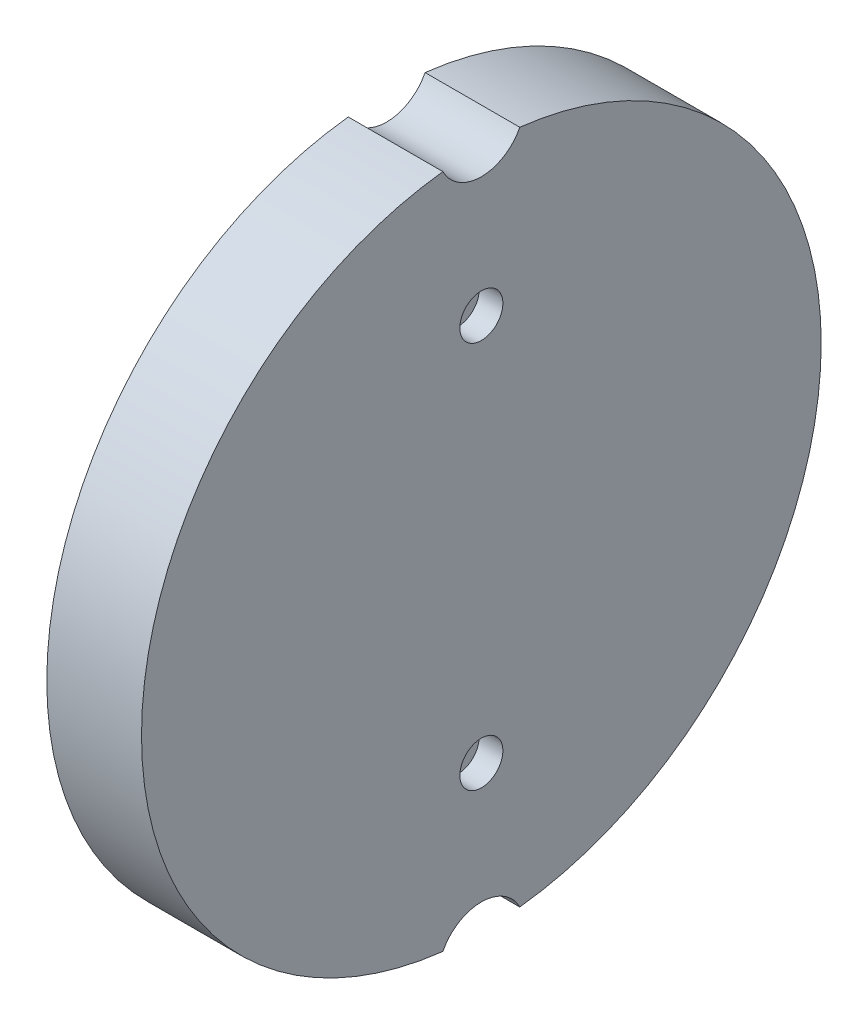
ISO-10303-21;
HEADER;
FILE_DESCRIPTION(('STEP AP214'),'2;1');
FILE_NAME('part.step','',(''),(''),'','','');
FILE_SCHEMA(('AUTOMOTIVE_DESIGN { 1 0 10303 214 1 1 1 1 }'));
ENDSEC;
DATA;
#1=APPLICATION_CONTEXT('core data for automotive mechanical design processes');
#2=APPLICATION_PROTOCOL_DEFINITION('international standard','automotive_design',2000,#1);
#3=PRODUCT_CONTEXT('',#1,'mechanical');
#4=PRODUCT('Part','Part','',(#3));
#5=PRODUCT_RELATED_PRODUCT_CATEGORY('part','',(#4));
#6=PRODUCT_DEFINITION_FORMATION('','',#4);
#7=PRODUCT_DEFINITION_CONTEXT('part definition',#1,'design');
#8=PRODUCT_DEFINITION('design','',#6,#7);
#9=PRODUCT_DEFINITION_SHAPE('','',#8);
#10=(LENGTH_UNIT() NAMED_UNIT(*) SI_UNIT(.MILLI.,.METRE.));
#11=(NAMED_UNIT(*) PLANE_ANGLE_UNIT() SI_UNIT($,.RADIAN.));
#12=(NAMED_UNIT(*) SI_UNIT($,.STERADIAN.) SOLID_ANGLE_UNIT());
#13=UNCERTAINTY_MEASURE_WITH_UNIT(LENGTH_MEASURE(1.E-05),#10,'distance_accuracy_value','');
#14=(GEOMETRIC_REPRESENTATION_CONTEXT(3) GLOBAL_UNCERTAINTY_ASSIGNED_CONTEXT((#13)) GLOBAL_UNIT_ASSIGNED_CONTEXT((#10,
#11,#12)) REPRESENTATION_CONTEXT('',''));
#15=CARTESIAN_POINT('',(0.,0.,0.));
#16=DIRECTION('',(0.,0.,1.));
#17=DIRECTION('',(1.,0.,0.));
#18=AXIS2_PLACEMENT_3D('',#15,#16,#17);
#19=CARTESIAN_POINT('',(55.63,-4.5,0.));
#20=DIRECTION('',(-1.,0.,0.));
#21=DIRECTION('',(0.,0.,1.));
#22=AXIS2_PLACEMENT_3D('',#19,#20,#21);
#23=PLANE('',#22);
#24=CARTESIAN_POINT('',(55.63,-4.5,0.));
#25=DIRECTION('',(1.,0.,0.));
#26=DIRECTION('',(0.,0.,-1.));
#27=AXIS2_PLACEMENT_3D('',#24,#25,#26);
#28=CIRCLE('',#27,0.5);
#29=CARTESIAN_POINT('',(55.63,-4.5,-0.5));
#30=VERTEX_POINT('',#29);
#31=EDGE_CURVE('E19',#30,#30,#28,.T.);
#32=ORIENTED_EDGE('',*,*,#31,.T.);
#33=EDGE_LOOP('',(#32));
#34=FACE_BOUND('',#33,.T.);
#35=ADVANCED_FACE('F16',(#34),#23,.F.);
#36=CARTESIAN_POINT('',(55.63,4.5,0.));
#37=DIRECTION('',(-1.,0.,0.));
#38=DIRECTION('',(0.,0.,1.));
#39=AXIS2_PLACEMENT_3D('',#36,#37,#38);
#40=PLANE('',#39);
#41=CARTESIAN_POINT('',(55.63,4.5,0.));
#42=DIRECTION('',(1.,0.,0.));
#43=DIRECTION('',(0.,0.,-1.));
#44=AXIS2_PLACEMENT_3D('',#41,#42,#43);
#45=CIRCLE('',#44,0.5);
#46=CARTESIAN_POINT('',(55.63,4.5,-0.5));
#47=VERTEX_POINT('',#46);
#48=EDGE_CURVE('E96',#47,#47,#45,.T.);
#49=ORIENTED_EDGE('',*,*,#48,.T.);
#50=EDGE_LOOP('',(#49));
#51=FACE_BOUND('',#50,.T.);
#52=ADVANCED_FACE('F107',(#51),#40,.F.);
#53=CARTESIAN_POINT('',(55.905,-4.5,0.));
#54=DIRECTION('',(1.,0.,0.));
#55=DIRECTION('',(0.,0.,-1.));
#56=AXIS2_PLACEMENT_3D('',#53,#54,#55);
#57=CYLINDRICAL_SURFACE('',#56,0.5);
#58=CARTESIAN_POINT('',(56.18,-4.5,0.));
#59=DIRECTION('',(1.,0.,0.));
#60=DIRECTION('',(0.,0.,-1.));
#61=AXIS2_PLACEMENT_3D('',#58,#59,#60);
#62=CIRCLE('',#61,0.5);
#63=CARTESIAN_POINT('',(56.18,-4.5,-0.5));
#64=VERTEX_POINT('',#63);
#65=EDGE_CURVE('E94',#64,#64,#62,.F.);
#66=ORIENTED_EDGE('',*,*,#65,.F.);
#67=EDGE_LOOP('',(#66));
#68=FACE_BOUND('',#67,.T.);
#69=ORIENTED_EDGE('',*,*,#31,.F.);
#70=EDGE_LOOP('',(#69));
#71=FACE_BOUND('',#70,.T.);
#72=ADVANCED_FACE('F104',(#68,#71),#57,.F.);
#73=CARTESIAN_POINT('',(55.905,4.5,0.));
#74=DIRECTION('',(1.,0.,0.));
#75=DIRECTION('',(0.,0.,-1.));
#76=AXIS2_PLACEMENT_3D('',#73,#74,#75);
#77=CYLINDRICAL_SURFACE('',#76,0.5);
#78=CARTESIAN_POINT('',(56.18,4.5,0.));
#79=DIRECTION('',(1.,0.,0.));
#80=DIRECTION('',(0.,0.,-1.));
#81=AXIS2_PLACEMENT_3D('',#78,#79,#80);
#82=CIRCLE('',#81,0.5);
#83=CARTESIAN_POINT('',(56.18,4.5,-0.5));
#84=VERTEX_POINT('',#83);
#85=EDGE_CURVE('E74',#84,#84,#82,.F.);
#86=ORIENTED_EDGE('',*,*,#85,.F.);
#87=EDGE_LOOP('',(#86));
#88=FACE_BOUND('',#87,.T.);
#89=ORIENTED_EDGE('',*,*,#48,.F.);
#90=EDGE_LOOP('',(#89));
#91=FACE_BOUND('',#90,.T.);
#92=ADVANCED_FACE('F106',(#88,#91),#77,.F.);
#93=CARTESIAN_POINT('',(56.18,0.,3.9475));
#94=DIRECTION('',(1.,0.,0.));
#95=DIRECTION('',(0.,0.,-1.));
#96=AXIS2_PLACEMENT_3D('',#93,#94,#95);
#97=PLANE('',#96);
#98=CARTESIAN_POINT('',(56.18,0.,0.));
#99=DIRECTION('',(-1.,0.,0.));
#100=DIRECTION('',(0.,0.,1.));
#101=AXIS2_PLACEMENT_3D('',#98,#99,#100);
#102=CIRCLE('',#101,7.895);
#103=CARTESIAN_POINT('',(56.18,-7.8443670886076,0.892709347531437));
#104=VERTEX_POINT('',#103);
#105=CARTESIAN_POINT('',(56.18,7.8443670886076,0.892709347531438));
#106=VERTEX_POINT('',#105);
#107=EDGE_CURVE('E54',#104,#106,#102,.T.);
#108=ORIENTED_EDGE('',*,*,#107,.F.);
#109=CARTESIAN_POINT('',(56.18,-8.295,0.));
#110=DIRECTION('',(-1.,0.,0.));
#111=DIRECTION('',(0.,0.,1.));
#112=AXIS2_PLACEMENT_3D('',#109,#110,#111);
#113=CIRCLE('',#112,1.);
#114=CARTESIAN_POINT('',(56.18,-7.8443670886076,-0.892709347531438));
#115=VERTEX_POINT('',#114);
#116=EDGE_CURVE('E58',#104,#115,#113,.T.);
#117=ORIENTED_EDGE('',*,*,#116,.T.);
#118=CARTESIAN_POINT('',(56.18,0.,0.));
#119=DIRECTION('',(-1.,0.,0.));
#120=DIRECTION('',(0.,0.,1.));
#121=AXIS2_PLACEMENT_3D('',#118,#119,#120);
#122=CIRCLE('',#121,7.895);
#123=CARTESIAN_POINT('',(56.18,7.8443670886076,-0.892709347531439));
#124=VERTEX_POINT('',#123);
#125=EDGE_CURVE('E89',#124,#115,#122,.T.);
#126=ORIENTED_EDGE('',*,*,#125,.F.);
#127=CARTESIAN_POINT('',(56.18,8.295,0.));
#128=DIRECTION('',(-1.,0.,0.));
#129=DIRECTION('',(0.,0.,1.));
#130=AXIS2_PLACEMENT_3D('',#127,#128,#129);
#131=CIRCLE('',#130,1.);
#132=EDGE_CURVE('E60',#124,#106,#131,.T.);
#133=ORIENTED_EDGE('',*,*,#132,.T.);
#134=EDGE_LOOP('',(#108,#117,#126,#133));
#135=FACE_BOUND('',#134,.T.);
#136=ORIENTED_EDGE('',*,*,#85,.T.);
#137=EDGE_LOOP('',(#136));
#138=FACE_BOUND('',#137,.T.);
#139=ORIENTED_EDGE('',*,*,#65,.T.);
#140=EDGE_LOOP('',(#139));
#141=FACE_BOUND('',#140,.T.);
#142=ADVANCED_FACE('F56',(#135,#138,#141),#97,.T.);
#143=CARTESIAN_POINT('',(55.08,-8.295,0.));
#144=DIRECTION('',(-1.,0.,0.));
#145=DIRECTION('',(0.,0.,1.));
#146=AXIS2_PLACEMENT_3D('',#143,#144,#145);
#147=CYLINDRICAL_SURFACE('',#146,1.);
#148=CARTESIAN_POINT('',(53.98,-8.295,0.));
#149=DIRECTION('',(-1.,0.,0.));
#150=DIRECTION('',(0.,0.,1.));
#151=AXIS2_PLACEMENT_3D('',#148,#149,#150);
#152=CIRCLE('',#151,1.);
#153=CARTESIAN_POINT('',(53.98,-7.8443670886076,-0.892709347531438));
#154=VERTEX_POINT('',#153);
#155=CARTESIAN_POINT('',(53.98,-7.8443670886076,0.892709347531433));
#156=VERTEX_POINT('',#155);
#157=EDGE_CURVE('E87',#154,#156,#152,.F.);
#158=ORIENTED_EDGE('',*,*,#157,.F.);
#159=DIRECTION('',(-1.,0.,0.));
#160=VECTOR('',#159,1.);
#161=CARTESIAN_POINT('',(55.08,-7.84436708860759,-0.892709347531439));
#162=LINE('',#161,#160);
#163=EDGE_CURVE('E72',#115,#154,#162,.T.);
#164=ORIENTED_EDGE('',*,*,#163,.F.);
#165=ORIENTED_EDGE('',*,*,#116,.F.);
#166=DIRECTION('',(-1.,0.,0.));
#167=VECTOR('',#166,1.);
#168=CARTESIAN_POINT('',(55.08,-7.8443670886076,0.892709347531436));
#169=LINE('',#168,#167);
#170=EDGE_CURVE('E65',#156,#104,#169,.F.);
#171=ORIENTED_EDGE('',*,*,#170,.F.);
#172=EDGE_LOOP('',(#158,#164,#165,#171));
#173=FACE_BOUND('',#172,.T.);
#174=ADVANCED_FACE('F69',(#173),#147,.F.);
#175=CARTESIAN_POINT('',(55.08,0.,0.));
#176=DIRECTION('',(-1.,0.,0.));
#177=DIRECTION('',(0.,0.,1.));
#178=AXIS2_PLACEMENT_3D('',#175,#176,#177);
#179=CYLINDRICAL_SURFACE('',#178,7.895);
#180=DIRECTION('',(-1.,0.,0.));
#181=VECTOR('',#180,1.);
#182=CARTESIAN_POINT('',(55.08,7.8443670886076,0.892709347531439));
#183=LINE('',#182,#181);
#184=CARTESIAN_POINT('',(53.98,7.8443670886076,0.892709347531438));
#185=VERTEX_POINT('',#184);
#186=EDGE_CURVE('E81',#106,#185,#183,.T.);
#187=ORIENTED_EDGE('',*,*,#186,.T.);
#188=CARTESIAN_POINT('',(53.98,0.,0.));
#189=DIRECTION('',(-1.,0.,0.));
#190=DIRECTION('',(0.,0.,1.));
#191=AXIS2_PLACEMENT_3D('',#188,#189,#190);
#192=CIRCLE('',#191,7.895);
#193=EDGE_CURVE('E77',#156,#185,#192,.T.);
#194=ORIENTED_EDGE('',*,*,#193,.F.);
#195=ORIENTED_EDGE('',*,*,#170,.T.);
#196=ORIENTED_EDGE('',*,*,#107,.T.);
#197=EDGE_LOOP('',(#187,#194,#195,#196));
#198=FACE_BOUND('',#197,.T.);
#199=ADVANCED_FACE('F76',(#198),#179,.T.);
#200=CARTESIAN_POINT('',(55.08,8.295,0.));
#201=DIRECTION('',(-1.,0.,0.));
#202=DIRECTION('',(0.,0.,1.));
#203=AXIS2_PLACEMENT_3D('',#200,#201,#202);
#204=CYLINDRICAL_SURFACE('',#203,1.);
#205=CARTESIAN_POINT('',(53.98,8.295,0.));
#206=DIRECTION('',(-1.,0.,0.));
#207=DIRECTION('',(0.,0.,1.));
#208=AXIS2_PLACEMENT_3D('',#205,#206,#207);
#209=CIRCLE('',#208,1.);
#210=CARTESIAN_POINT('',(53.98,7.8443670886076,-0.892709347531435));
#211=VERTEX_POINT('',#210);
#212=EDGE_CURVE('E25',#185,#211,#209,.F.);
#213=ORIENTED_EDGE('',*,*,#212,.F.);
#214=ORIENTED_EDGE('',*,*,#186,.F.);
#215=ORIENTED_EDGE('',*,*,#132,.F.);
#216=DIRECTION('',(-1.,0.,0.));
#217=VECTOR('',#216,1.);
#218=CARTESIAN_POINT('',(55.08,7.84436708860759,-0.89270934753144));
#219=LINE('',#218,#217);
#220=EDGE_CURVE('E34',#211,#124,#219,.F.);
#221=ORIENTED_EDGE('',*,*,#220,.F.);
#222=EDGE_LOOP('',(#213,#214,#215,#221));
#223=FACE_BOUND('',#222,.T.);
#224=ADVANCED_FACE('F128',(#223),#204,.F.);
#225=CARTESIAN_POINT('',(55.08,0.,0.));
#226=DIRECTION('',(-1.,0.,0.));
#227=DIRECTION('',(0.,0.,1.));
#228=AXIS2_PLACEMENT_3D('',#225,#226,#227);
#229=CYLINDRICAL_SURFACE('',#228,7.895);
#230=ORIENTED_EDGE('',*,*,#163,.T.);
#231=CARTESIAN_POINT('',(53.98,0.,0.));
#232=DIRECTION('',(-1.,0.,0.));
#233=DIRECTION('',(0.,0.,1.));
#234=AXIS2_PLACEMENT_3D('',#231,#232,#233);
#235=CIRCLE('',#234,7.895);
#236=EDGE_CURVE('E11',#211,#154,#235,.T.);
#237=ORIENTED_EDGE('',*,*,#236,.F.);
#238=ORIENTED_EDGE('',*,*,#220,.T.);
#239=ORIENTED_EDGE('',*,*,#125,.T.);
#240=EDGE_LOOP('',(#230,#237,#238,#239));
#241=FACE_BOUND('',#240,.T.);
#242=ADVANCED_FACE('F121',(#241),#229,.T.);
#243=CARTESIAN_POINT('',(53.98,0.,3.9475));
#244=DIRECTION('',(-1.,0.,0.));
#245=DIRECTION('',(0.,0.,1.));
#246=AXIS2_PLACEMENT_3D('',#243,#244,#245);
#247=PLANE('',#246);
#248=ORIENTED_EDGE('',*,*,#236,.T.);
#249=ORIENTED_EDGE('',*,*,#157,.T.);
#250=ORIENTED_EDGE('',*,*,#193,.T.);
#251=ORIENTED_EDGE('',*,*,#212,.T.);
#252=EDGE_LOOP('',(#248,#249,#250,#251));
#253=FACE_BOUND('',#252,.T.);
#254=ADVANCED_FACE('F119',(#253),#247,.T.);
#255=CLOSED_SHELL('',(#35,#52,#72,#92,#142,#174,#199,#224,#242,#254));
#256=MANIFOLD_SOLID_BREP('B1',#255);
#257=ADVANCED_BREP_SHAPE_REPRESENTATION('',(#18,#256),#14);
#258=SHAPE_DEFINITION_REPRESENTATION(#9,#257);
ENDSEC;
END-ISO-10303-21;
